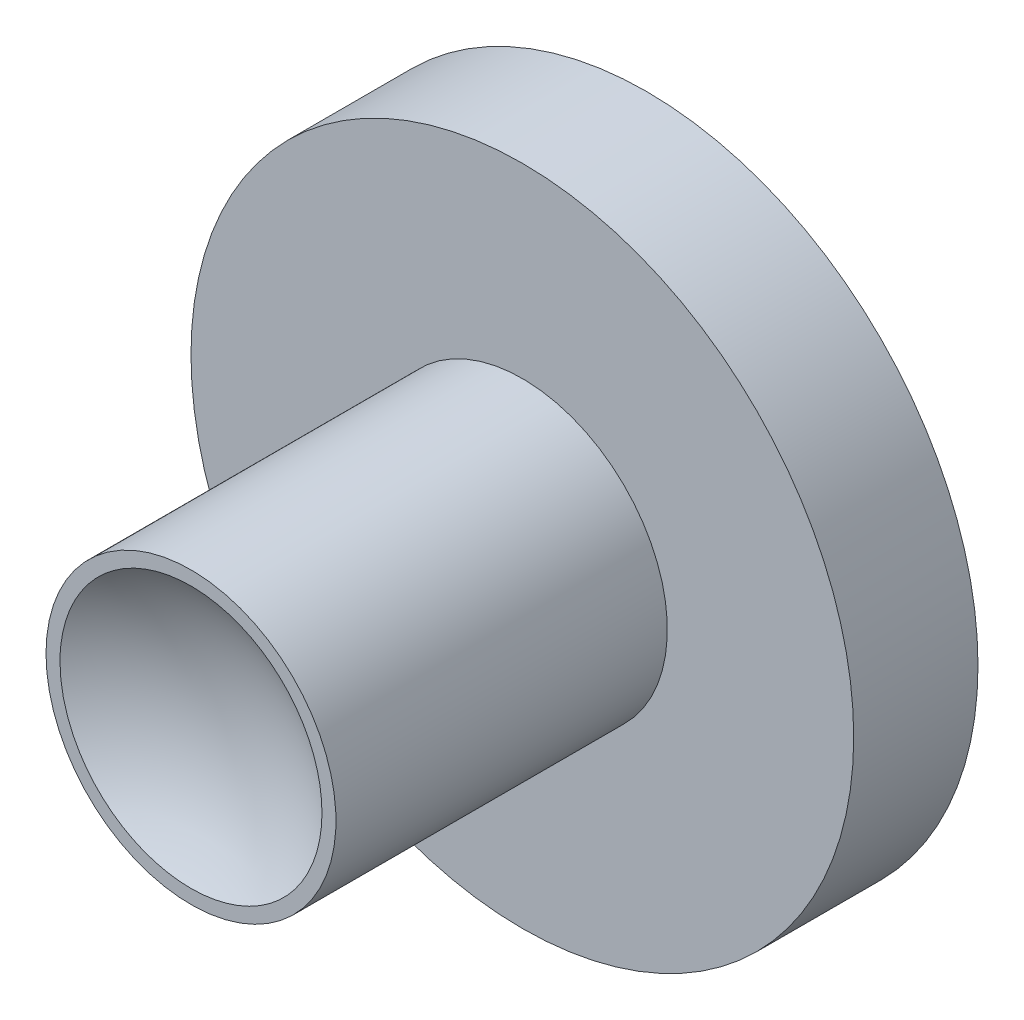
ISO-10303-21;
HEADER;
FILE_DESCRIPTION(('STEP AP214'),'2;1');
FILE_NAME('part.step','',(''),(''),'','','');
FILE_SCHEMA(('AUTOMOTIVE_DESIGN { 1 0 10303 214 1 1 1 1 }'));
ENDSEC;
DATA;
#1=APPLICATION_CONTEXT('core data for automotive mechanical design processes');
#2=APPLICATION_PROTOCOL_DEFINITION('international standard','automotive_design',2000,#1);
#3=PRODUCT_CONTEXT('',#1,'mechanical');
#4=PRODUCT('Part','Part','',(#3));
#5=PRODUCT_RELATED_PRODUCT_CATEGORY('part','',(#4));
#6=PRODUCT_DEFINITION_FORMATION('','',#4);
#7=PRODUCT_DEFINITION_CONTEXT('part definition',#1,'design');
#8=PRODUCT_DEFINITION('design','',#6,#7);
#9=PRODUCT_DEFINITION_SHAPE('','',#8);
#10=(LENGTH_UNIT() NAMED_UNIT(*) SI_UNIT(.MILLI.,.METRE.));
#11=(NAMED_UNIT(*) PLANE_ANGLE_UNIT() SI_UNIT($,.RADIAN.));
#12=(NAMED_UNIT(*) SI_UNIT($,.STERADIAN.) SOLID_ANGLE_UNIT());
#13=UNCERTAINTY_MEASURE_WITH_UNIT(LENGTH_MEASURE(1.E-05),#10,'distance_accuracy_value','');
#14=(GEOMETRIC_REPRESENTATION_CONTEXT(3) GLOBAL_UNCERTAINTY_ASSIGNED_CONTEXT((#13)) GLOBAL_UNIT_ASSIGNED_CONTEXT((#10,
#11,#12)) REPRESENTATION_CONTEXT('',''));
#15=CARTESIAN_POINT('',(0.,0.,0.));
#16=DIRECTION('',(0.,0.,1.));
#17=DIRECTION('',(1.,0.,0.));
#18=AXIS2_PLACEMENT_3D('',#15,#16,#17);
#19=CARTESIAN_POINT('',(0.,0.,7.75));
#20=DIRECTION('',(0.,-1.,0.));
#21=DIRECTION('',(1.,0.,0.));
#22=AXIS2_PLACEMENT_3D('',#19,#20,#21);
#23=SPHERICAL_SURFACE('',#22,2.75);
#24=CARTESIAN_POINT('',(-1.58113883008419,0.,5.5));
#25=CARTESIAN_POINT('',(-1.58113273322599,-0.0888249318743245,5.50000000000003));
#26=CARTESIAN_POINT('',(-1.57361851907905,-0.177742545680218,5.50000000000002));
#27=CARTESIAN_POINT('',(-1.55126425883766,-0.30913909354073,5.49999999999999));
#28=CARTESIAN_POINT('',(-1.54195341460163,-0.352643033493433,5.49999999999998));
#29=CARTESIAN_POINT('',(-1.51969457086993,-0.43875548304335,5.50000000000002));
#30=CARTESIAN_POINT('',(-1.50674336665949,-0.481363167957671,5.50000000000008));
#31=CARTESIAN_POINT('',(-1.46259485190823,-0.607207970763083,5.50000000000013));
#32=CARTESIAN_POINT('',(-1.42607310947809,-0.688639295844799,5.49999999999999));
#33=CARTESIAN_POINT('',(-1.33985984577241,-0.844206060689953,5.50000000000001));
#34=CARTESIAN_POINT('',(-1.29016806893717,-0.918341358838367,5.50000000000015));
#35=CARTESIAN_POINT('',(-1.20687596711824,-1.02246495949152,5.5000000000001));
#36=CARTESIAN_POINT('',(-1.17763034288731,-1.05601301878158,5.50000000000003));
#37=CARTESIAN_POINT('',(-1.11644966756722,-1.12049723998001,5.49999999999997));
#38=CARTESIAN_POINT('',(-1.08451722821914,-1.15143588111839,5.49999999999996));
#39=CARTESIAN_POINT('',(-0.984948327655086,-1.2400638304656,5.50000000000007));
#40=CARTESIAN_POINT('',(-0.913519506200672,-1.29359108666862,5.50000000000031));
#41=CARTESIAN_POINT('',(-0.762726752893889,-1.38786345862483,5.50000000000029));
#42=CARTESIAN_POINT('',(-0.683362968852126,-1.42860881241779,5.50000000000004));
#43=CARTESIAN_POINT('',(-0.51891173946665,-1.49620494673952,5.49999999999996));
#44=CARTESIAN_POINT('',(-0.433824305632437,-1.52305575520743,5.50000000000015));
#45=CARTESIAN_POINT('',(-0.26035170100706,-1.56208924492021,5.49999999999985));
#46=CARTESIAN_POINT('',(-0.171966523929541,-1.5742718982023,5.49999999999937));
#47=CARTESIAN_POINT('',(0.00559516178062694,-1.58362622711124,5.50000000000063));
#48=CARTESIAN_POINT('',(0.0947716689870887,-1.58079792978633,5.50000000000236));
#49=CARTESIAN_POINT('',(0.271383972399603,-1.560209877638,5.50000000000204));
#50=CARTESIAN_POINT('',(0.358819767956103,-1.54245011724297,5.5));
#51=CARTESIAN_POINT('',(0.529468870201816,-1.49250347306437,5.5));
#52=CARTESIAN_POINT('',(0.612682172433631,-1.46031657405141,5.50000000000203));
#53=CARTESIAN_POINT('',(0.77252392313665,-1.38242929443802,5.50000000000215));
#54=CARTESIAN_POINT('',(0.849152373750684,-1.33672891823513,5.50000000000023));
#55=CARTESIAN_POINT('',(0.993649180079402,-1.23311201715394,5.49999999999977));
#56=CARTESIAN_POINT('',(1.06151753933987,-1.17519549722034,5.50000000000125));
#57=CARTESIAN_POINT('',(1.186567621583,-1.04879036362742,5.5000000000015));
#58=CARTESIAN_POINT('',(1.24374934310115,-0.980301748519294,5.50000000000029));
#59=CARTESIAN_POINT('',(1.34580292531478,-0.834696612125115,5.49999999999971));
#60=CARTESIAN_POINT('',(1.39067478440157,-0.757580089711544,5.50000000000035));
#61=CARTESIAN_POINT('',(1.46683484960303,-0.596908260764354,5.50000000000054));
#62=CARTESIAN_POINT('',(1.4981230562993,-0.513352954506426,5.5000000000001));
#63=CARTESIAN_POINT('',(1.54622763828986,-0.342175448502189,5.4999999999999));
#64=CARTESIAN_POINT('',(1.56304401423612,-0.254553248939097,5.50000000000014));
#65=CARTESIAN_POINT('',(1.58172756964237,-0.0777292893199153,5.5000000000002));
#66=CARTESIAN_POINT('',(1.58359474910237,0.011472470736175,5.50000000000003));
#67=CARTESIAN_POINT('',(1.5723269075772,0.188923379772034,5.49999999999997));
#68=CARTESIAN_POINT('',(1.55919188591616,0.277172528708887,5.5000000000001));
#69=CARTESIAN_POINT('',(1.5182925047288,0.450213081086602,5.50000000000011));
#70=CARTESIAN_POINT('',(1.4905281445761,0.535004484379418,5.5));
#71=CARTESIAN_POINT('',(1.42115823958132,0.698722552007584,5.5));
#72=CARTESIAN_POINT('',(1.37955269654804,0.777649217109357,5.50000000000011));
#73=CARTESIAN_POINT('',(1.28368148909619,0.927397313756252,5.5000000000001));
#74=CARTESIAN_POINT('',(1.22941582641259,0.998218746412128,5.49999999999998));
#75=CARTESIAN_POINT('',(1.10976479904475,1.12974600928402,5.50000000000002));
#76=CARTESIAN_POINT('',(1.04437942985965,1.19045183540557,5.50000000000019));
#77=CARTESIAN_POINT('',(0.904345062948117,1.300024595146,5.50000000000021));
#78=CARTESIAN_POINT('',(0.829696062207122,1.34889152491226,5.50000000000005));
#79=CARTESIAN_POINT('',(0.673253666933472,1.43339927794716,5.49999999999995));
#80=CARTESIAN_POINT('',(0.591460279942582,1.46904011517733,5.5));
#81=CARTESIAN_POINT('',(0.423050697010908,1.52608383511938,5.50000000000001));
#82=CARTESIAN_POINT('',(0.33643450286975,1.5474867231441,5.49999999999997));
#83=CARTESIAN_POINT('',(0.16083882792979,1.57544767169637,5.50000000000003));
#84=CARTESIAN_POINT('',(0.0718593428728547,1.58200570547491,5.50000000000014));
#85=CARTESIAN_POINT('',(-0.105940211198095,1.58008829920312,5.49999999999986));
#86=CARTESIAN_POINT('',(-0.194760280515689,1.57161288781189,5.49999999999946));
#87=CARTESIAN_POINT('',(-0.369706994825432,1.53987818482321,5.50000000000054));
#88=CARTESIAN_POINT('',(-0.455833634401253,1.51661886349819,5.50000000000201));
#89=CARTESIAN_POINT('',(-0.622998564928332,1.45594250429706,5.50000000000206));
#90=CARTESIAN_POINT('',(-0.704036761081042,1.41852520274662,5.50000000000063));
#91=CARTESIAN_POINT('',(-0.819929350335222,1.35266332362833,5.49999999999968));
#92=CARTESIAN_POINT('',(-0.85762253001508,1.32908145763283,5.49999999999956));
#93=CARTESIAN_POINT('',(-0.930928785047508,1.27880738092018,5.50000000000043));
#94=CARTESIAN_POINT('',(-0.966539824467981,1.25211219989104,5.50000000000142));
#95=CARTESIAN_POINT('',(-1.0697534892186,1.16769515275515,5.5000000000024));
#96=CARTESIAN_POINT('',(-1.13384153124643,1.10558204636318,5.5000000000004));
#97=CARTESIAN_POINT('',(-1.25066298630246,0.971468315515379,5.4999999999996));
#98=CARTESIAN_POINT('',(-1.30339661965081,0.899467882956939,5.50000000000079));
#99=CARTESIAN_POINT('',(-1.37287060491444,0.785628649300403,5.50000000000057));
#100=CARTESIAN_POINT('',(-1.39444041921137,0.746668520765464,5.50000000000016));
#101=CARTESIAN_POINT('',(-1.43420442271232,0.667109523050883,5.49999999999984));
#102=CARTESIAN_POINT('',(-1.45240157351261,0.626512130098269,5.49999999999992));
#103=CARTESIAN_POINT('',(-1.5017228345197,0.502688953942562,5.50000000000016));
#104=CARTESIAN_POINT('',(-1.52765405709999,0.417305248502454,5.50000000000029));
#105=CARTESIAN_POINT('',(-1.557827693088,0.276162853969674,5.50000000000017));
#106=CARTESIAN_POINT('',(-1.56655705520819,0.221305304343385,5.50000000000005));
#107=CARTESIAN_POINT('',(-1.57821452867008,0.110977233915531,5.49999999999995));
#108=CARTESIAN_POINT('',(-1.58114264001178,0.0555067131139651,5.49999999999998));
#109=CARTESIAN_POINT('',(-1.58113883008419,0.,5.5));
#110=B_SPLINE_CURVE_WITH_KNOTS('',3,(#24,#25,#26,#27,#28,#29,#30,#31,#32,#33,#34,#35,#36,#37,
#38,#39,#40,#41,#42,#43,#44,#45,#46,#47,#48,#49,#50,#51,#52,#53,#54,#55,#56,#57,#58,#59,#60,#61,
#62,#63,#64,#65,#66,#67,#68,#69,#70,#71,#72,#73,#74,#75,#76,#77,#78,#79,#80,#81,#82,#83,#84,#85,
#86,#87,#88,#89,#90,#91,#92,#93,#94,#95,#96,#97,#98,#99,#100,#101,#102,#103,#104,#105,#106,#107,
#108,#109),.UNSPECIFIED.,.T.,.F.,(4,2,2,2,2,2,2,2,2,2,2,2,2,2,2,2,2,2,2,2,2,2,2,2,2,2,2,2,2,2,2,
2,2,2,2,2,2,2,2,2,2,2,4),(0.,0.266237227908444,0.399576021363302,0.533032566460143,
0.799427522207335,1.06582764762994,1.199206417839,1.33245700167909,1.5988597716649,
1.86525758008721,2.1316548528349,2.39805263343088,2.66444993400464,2.93084733398353,
3.1972450151741,3.46364260967374,3.73004009634457,3.99643761952305,4.26283517751525,
4.52923272410108,4.79563025868543,5.06202779326972,5.32842533985546,5.5948228978473,
5.86122042102546,6.12761790769608,6.39401550219546,6.66041318338626,6.92681058336545,
7.19320788393936,7.45960566453543,7.7260029372827,7.99240074570462,8.25880351569045,
8.39205409953057,8.52543286973956,8.79183299516246,9.05822795091019,9.19168449600714,
9.32502328946207,9.59126051737066,9.75763220061247,9.92400388385429),.UNSPECIFIED.);
#111=CARTESIAN_POINT('',(-1.58113883008419,0.,5.5));
#112=VERTEX_POINT('',#111);
#113=EDGE_CURVE('E20',#112,#112,#110,.F.);
#114=ORIENTED_EDGE('',*,*,#113,.F.);
#115=EDGE_LOOP('',(#114));
#116=FACE_BOUND('',#115,.T.);
#117=ADVANCED_FACE('F15',(#116),#23,.F.);
#118=CARTESIAN_POINT('',(0.,0.,5.5));
#119=DIRECTION('',(0.,0.,1.));
#120=DIRECTION('',(1.,0.,0.));
#121=AXIS2_PLACEMENT_3D('',#118,#119,#120);
#122=PLANE('',#121);
#123=CARTESIAN_POINT('',(0.,0.,5.5));
#124=DIRECTION('',(0.,0.,-1.));
#125=DIRECTION('',(-1.,0.,0.));
#126=AXIS2_PLACEMENT_3D('',#123,#124,#125);
#127=CIRCLE('',#126,1.75);
#128=CARTESIAN_POINT('',(-1.75,0.,5.5));
#129=VERTEX_POINT('',#128);
#130=EDGE_CURVE('E42',#129,#129,#127,.T.);
#131=ORIENTED_EDGE('',*,*,#130,.F.);
#132=EDGE_LOOP('',(#131));
#133=FACE_BOUND('',#132,.T.);
#134=ORIENTED_EDGE('',*,*,#113,.T.);
#135=EDGE_LOOP('',(#134));
#136=FACE_BOUND('',#135,.T.);
#137=ADVANCED_FACE('F52',(#133,#136),#122,.T.);
#138=CARTESIAN_POINT('',(0.,0.,8.));
#139=DIRECTION('',(0.,0.,-1.));
#140=DIRECTION('',(-1.,0.,0.));
#141=AXIS2_PLACEMENT_3D('',#138,#139,#140);
#142=CYLINDRICAL_SURFACE('',#141,1.75);
#143=ORIENTED_EDGE('',*,*,#130,.T.);
#144=EDGE_LOOP('',(#143));
#145=FACE_BOUND('',#144,.T.);
#146=CARTESIAN_POINT('',(0.,0.,1.5));
#147=DIRECTION('',(0.,0.,-1.));
#148=DIRECTION('',(-1.,0.,0.));
#149=AXIS2_PLACEMENT_3D('',#146,#147,#148);
#150=CIRCLE('',#149,1.75);
#151=CARTESIAN_POINT('',(-1.75,0.,1.5));
#152=VERTEX_POINT('',#151);
#153=EDGE_CURVE('E32',#152,#152,#150,.F.);
#154=ORIENTED_EDGE('',*,*,#153,.T.);
#155=EDGE_LOOP('',(#154));
#156=FACE_BOUND('',#155,.T.);
#157=ADVANCED_FACE('F59',(#145,#156),#142,.T.);
#158=CARTESIAN_POINT('',(0.,0.,1.5));
#159=DIRECTION('',(0.,0.,-1.));
#160=DIRECTION('',(-1.,0.,0.));
#161=AXIS2_PLACEMENT_3D('',#158,#159,#160);
#162=PLANE('',#161);
#163=CARTESIAN_POINT('',(0.,0.,1.5));
#164=DIRECTION('',(0.,0.,-1.));
#165=DIRECTION('',(-1.,0.,0.));
#166=AXIS2_PLACEMENT_3D('',#163,#164,#165);
#167=CIRCLE('',#166,4.);
#168=CARTESIAN_POINT('',(-4.,0.,1.5));
#169=VERTEX_POINT('',#168);
#170=EDGE_CURVE('E27',#169,#169,#167,.T.);
#171=ORIENTED_EDGE('',*,*,#170,.F.);
#172=EDGE_LOOP('',(#171));
#173=FACE_BOUND('',#172,.T.);
#174=ORIENTED_EDGE('',*,*,#153,.F.);
#175=EDGE_LOOP('',(#174));
#176=FACE_BOUND('',#175,.T.);
#177=ADVANCED_FACE('F69',(#173,#176),#162,.F.);
#178=CARTESIAN_POINT('',(0.,0.,1.5));
#179=DIRECTION('',(0.,0.,-1.));
#180=DIRECTION('',(-1.,0.,0.));
#181=AXIS2_PLACEMENT_3D('',#178,#179,#180);
#182=CYLINDRICAL_SURFACE('',#181,4.);
#183=CARTESIAN_POINT('',(0.,0.,0.));
#184=DIRECTION('',(0.,0.,-1.));
#185=DIRECTION('',(-1.,0.,0.));
#186=AXIS2_PLACEMENT_3D('',#183,#184,#185);
#187=CIRCLE('',#186,4.);
#188=CARTESIAN_POINT('',(-4.,0.,0.));
#189=VERTEX_POINT('',#188);
#190=EDGE_CURVE('E10',#189,#189,#187,.F.);
#191=ORIENTED_EDGE('',*,*,#190,.T.);
#192=EDGE_LOOP('',(#191));
#193=FACE_BOUND('',#192,.T.);
#194=ORIENTED_EDGE('',*,*,#170,.T.);
#195=EDGE_LOOP('',(#194));
#196=FACE_BOUND('',#195,.T.);
#197=ADVANCED_FACE('F63',(#193,#196),#182,.T.);
#198=CARTESIAN_POINT('',(0.,0.,0.));
#199=DIRECTION('',(0.,0.,1.));
#200=DIRECTION('',(1.,0.,0.));
#201=AXIS2_PLACEMENT_3D('',#198,#199,#200);
#202=PLANE('',#201);
#203=ORIENTED_EDGE('',*,*,#190,.F.);
#204=EDGE_LOOP('',(#203));
#205=FACE_BOUND('',#204,.T.);
#206=ADVANCED_FACE('F61',(#205),#202,.F.);
#207=CLOSED_SHELL('',(#117,#137,#157,#177,#197,#206));
#208=MANIFOLD_SOLID_BREP('B1',#207);
#209=ADVANCED_BREP_SHAPE_REPRESENTATION('',(#18,#208),#14);
#210=SHAPE_DEFINITION_REPRESENTATION(#9,#209);
ENDSEC;
END-ISO-10303-21;
